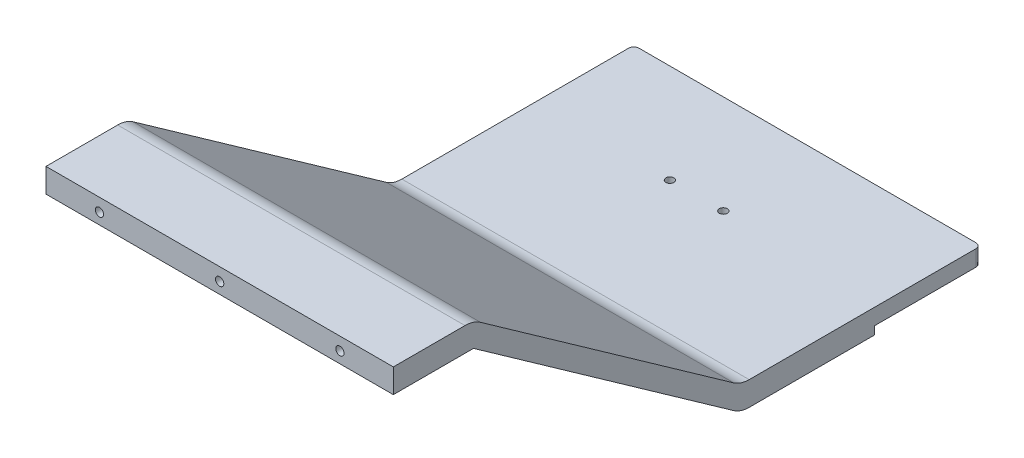
ISO-10303-21;
HEADER;
FILE_DESCRIPTION(('STEP AP214'),'2;1');
FILE_NAME('part.step','',(''),(''),'','','');
FILE_SCHEMA(('AUTOMOTIVE_DESIGN { 1 0 10303 214 1 1 1 1 }'));
ENDSEC;
DATA;
#1=APPLICATION_CONTEXT('core data for automotive mechanical design processes');
#2=APPLICATION_PROTOCOL_DEFINITION('international standard','automotive_design',2000,#1);
#3=PRODUCT_CONTEXT('',#1,'mechanical');
#4=PRODUCT('Part','Part','',(#3));
#5=PRODUCT_RELATED_PRODUCT_CATEGORY('part','',(#4));
#6=PRODUCT_DEFINITION_FORMATION('','',#4);
#7=PRODUCT_DEFINITION_CONTEXT('part definition',#1,'design');
#8=PRODUCT_DEFINITION('design','',#6,#7);
#9=PRODUCT_DEFINITION_SHAPE('','',#8);
#10=(LENGTH_UNIT() NAMED_UNIT(*) SI_UNIT(.MILLI.,.METRE.));
#11=(NAMED_UNIT(*) PLANE_ANGLE_UNIT() SI_UNIT($,.RADIAN.));
#12=(NAMED_UNIT(*) SI_UNIT($,.STERADIAN.) SOLID_ANGLE_UNIT());
#13=UNCERTAINTY_MEASURE_WITH_UNIT(LENGTH_MEASURE(1.E-05),#10,'distance_accuracy_value','');
#14=(GEOMETRIC_REPRESENTATION_CONTEXT(3) GLOBAL_UNCERTAINTY_ASSIGNED_CONTEXT((#13)) GLOBAL_UNIT_ASSIGNED_CONTEXT((#10,
#11,#12)) REPRESENTATION_CONTEXT('',''));
#15=CARTESIAN_POINT('',(0.,0.,0.));
#16=DIRECTION('',(0.,0.,1.));
#17=DIRECTION('',(1.,0.,0.));
#18=AXIS2_PLACEMENT_3D('',#15,#16,#17);
#19=CARTESIAN_POINT('',(209.,70.,-50.));
#20=DIRECTION('',(0.,0.,1.));
#21=DIRECTION('',(1.,0.,0.));
#22=AXIS2_PLACEMENT_3D('',#19,#20,#21);
#23=PLANE('',#22);
#24=DIRECTION('',(0.,1.,0.));
#25=VECTOR('',#24,1.);
#26=CARTESIAN_POINT('',(79.,70.,-50.));
#27=LINE('',#26,#25);
#28=CARTESIAN_POINT('',(79.,70.,-50.));
#29=VERTEX_POINT('',#28);
#30=CARTESIAN_POINT('',(79.,73.,-50.));
#31=VERTEX_POINT('',#30);
#32=EDGE_CURVE('E190',#29,#31,#27,.T.);
#33=ORIENTED_EDGE('',*,*,#32,.T.);
#34=DIRECTION('',(-1.,0.,0.));
#35=VECTOR('',#34,1.);
#36=CARTESIAN_POINT('',(209.,73.,-50.));
#37=LINE('',#36,#35);
#38=CARTESIAN_POINT('',(209.,73.,-50.));
#39=VERTEX_POINT('',#38);
#40=EDGE_CURVE('E252',#39,#31,#37,.T.);
#41=ORIENTED_EDGE('',*,*,#40,.F.);
#42=DIRECTION('',(0.,1.,0.));
#43=VECTOR('',#42,1.);
#44=CARTESIAN_POINT('',(209.,70.,-50.));
#45=LINE('',#44,#43);
#46=CARTESIAN_POINT('',(209.,70.,-50.));
#47=VERTEX_POINT('',#46);
#48=EDGE_CURVE('E196',#47,#39,#45,.T.);
#49=ORIENTED_EDGE('',*,*,#48,.F.);
#50=DIRECTION('',(-1.,0.,0.));
#51=VECTOR('',#50,1.);
#52=CARTESIAN_POINT('',(209.,70.,-50.));
#53=LINE('',#52,#51);
#54=EDGE_CURVE('E212',#47,#29,#53,.T.);
#55=ORIENTED_EDGE('',*,*,#54,.T.);
#56=EDGE_LOOP('',(#33,#41,#49,#55));
#57=FACE_BOUND('',#56,.T.);
#58=ADVANCED_FACE('F57',(#57),#23,.F.);
#59=CARTESIAN_POINT('',(209.,73.,-50.));
#60=DIRECTION('',(0.,1.,0.));
#61=DIRECTION('',(0.,0.,1.));
#62=AXIS2_PLACEMENT_3D('',#59,#60,#61);
#63=PLANE('',#62);
#64=CARTESIAN_POINT('',(129.5,73.,-53.));
#65=DIRECTION('',(0.,-1.,0.));
#66=DIRECTION('',(0.,0.,-1.));
#67=AXIS2_PLACEMENT_3D('',#64,#65,#66);
#68=CIRCLE('',#67,1.5);
#69=CARTESIAN_POINT('',(129.5,73.,-54.5));
#70=VERTEX_POINT('',#69);
#71=EDGE_CURVE('E278',#70,#70,#68,.T.);
#72=ORIENTED_EDGE('',*,*,#71,.F.);
#73=EDGE_LOOP('',(#72));
#74=FACE_BOUND('',#73,.T.);
#75=CARTESIAN_POINT('',(149.5,73.,-53.));
#76=DIRECTION('',(0.,-1.,0.));
#77=DIRECTION('',(0.,0.,-1.));
#78=AXIS2_PLACEMENT_3D('',#75,#76,#77);
#79=CIRCLE('',#78,1.5);
#80=CARTESIAN_POINT('',(149.5,73.,-54.5));
#81=VERTEX_POINT('',#80);
#82=EDGE_CURVE('E557',#81,#81,#79,.T.);
#83=ORIENTED_EDGE('',*,*,#82,.F.);
#84=EDGE_LOOP('',(#83));
#85=FACE_BOUND('',#84,.T.);
#86=DIRECTION('',(-1.,0.,0.));
#87=VECTOR('',#86,1.);
#88=CARTESIAN_POINT('',(209.,73.,-90.));
#89=LINE('',#88,#87);
#90=CARTESIAN_POINT('',(207.,73.,-90.));
#91=VERTEX_POINT('',#90);
#92=CARTESIAN_POINT('',(81.,73.,-90.));
#93=VERTEX_POINT('',#92);
#94=EDGE_CURVE('E247',#91,#93,#89,.T.);
#95=ORIENTED_EDGE('',*,*,#94,.F.);
#96=CARTESIAN_POINT('',(207.,73.,-88.));
#97=DIRECTION('',(0.,1.,0.));
#98=DIRECTION('',(0.,0.,1.));
#99=AXIS2_PLACEMENT_3D('',#96,#97,#98);
#100=CIRCLE('',#99,2.);
#101=CARTESIAN_POINT('',(209.,73.,-88.));
#102=VERTEX_POINT('',#101);
#103=EDGE_CURVE('E270',#91,#102,#100,.F.);
#104=ORIENTED_EDGE('',*,*,#103,.T.);
#105=DIRECTION('',(0.,0.,-1.));
#106=VECTOR('',#105,1.);
#107=CARTESIAN_POINT('',(209.,73.,-50.));
#108=LINE('',#107,#106);
#109=EDGE_CURVE('E198',#39,#102,#108,.T.);
#110=ORIENTED_EDGE('',*,*,#109,.F.);
#111=ORIENTED_EDGE('',*,*,#40,.T.);
#112=DIRECTION('',(0.,0.,-1.));
#113=VECTOR('',#112,1.);
#114=CARTESIAN_POINT('',(79.,73.,-50.));
#115=LINE('',#114,#113);
#116=CARTESIAN_POINT('',(79.,73.,-88.));
#117=VERTEX_POINT('',#116);
#118=EDGE_CURVE('E188',#31,#117,#115,.T.);
#119=ORIENTED_EDGE('',*,*,#118,.T.);
#120=CARTESIAN_POINT('',(81.,73.,-88.));
#121=DIRECTION('',(0.,1.,0.));
#122=DIRECTION('',(0.,0.,1.));
#123=AXIS2_PLACEMENT_3D('',#120,#121,#122);
#124=CIRCLE('',#123,2.);
#125=EDGE_CURVE('E267',#117,#93,#124,.F.);
#126=ORIENTED_EDGE('',*,*,#125,.T.);
#127=EDGE_LOOP('',(#95,#104,#110,#111,#119,#126));
#128=FACE_BOUND('',#127,.T.);
#129=ADVANCED_FACE('F321',(#74,#85,#128),#63,.F.);
#130=CARTESIAN_POINT('',(209.,73.,-90.));
#131=DIRECTION('',(0.,0.,1.));
#132=DIRECTION('',(1.,0.,0.));
#133=AXIS2_PLACEMENT_3D('',#130,#131,#132);
#134=PLANE('',#133);
#135=DIRECTION('',(-1.,0.,0.));
#136=VECTOR('',#135,1.);
#137=CARTESIAN_POINT('',(209.,79.,-90.));
#138=LINE('',#137,#136);
#139=CARTESIAN_POINT('',(207.,79.,-90.));
#140=VERTEX_POINT('',#139);
#141=CARTESIAN_POINT('',(81.,79.,-90.));
#142=VERTEX_POINT('',#141);
#143=EDGE_CURVE('E244',#140,#142,#138,.T.);
#144=ORIENTED_EDGE('',*,*,#143,.F.);
#145=DIRECTION('',(0.,1.,0.));
#146=VECTOR('',#145,1.);
#147=CARTESIAN_POINT('',(207.,73.,-90.));
#148=LINE('',#147,#146);
#149=EDGE_CURVE('E263',#140,#91,#148,.F.);
#150=ORIENTED_EDGE('',*,*,#149,.T.);
#151=ORIENTED_EDGE('',*,*,#94,.T.);
#152=DIRECTION('',(0.,1.,0.));
#153=VECTOR('',#152,1.);
#154=CARTESIAN_POINT('',(81.,73.,-90.));
#155=LINE('',#154,#153);
#156=EDGE_CURVE('E261',#93,#142,#155,.T.);
#157=ORIENTED_EDGE('',*,*,#156,.T.);
#158=EDGE_LOOP('',(#144,#150,#151,#157));
#159=FACE_BOUND('',#158,.T.);
#160=ADVANCED_FACE('F357',(#159),#134,.F.);
#161=CARTESIAN_POINT('',(209.,79.,-90.));
#162=DIRECTION('',(0.,-1.,0.));
#163=DIRECTION('',(0.,0.,-1.));
#164=AXIS2_PLACEMENT_3D('',#161,#162,#163);
#165=PLANE('',#164);
#166=CARTESIAN_POINT('',(129.5,79.,-53.));
#167=DIRECTION('',(0.,-1.,0.));
#168=DIRECTION('',(0.,0.,-1.));
#169=AXIS2_PLACEMENT_3D('',#166,#167,#168);
#170=CIRCLE('',#169,1.5);
#171=CARTESIAN_POINT('',(129.5,79.,-54.5));
#172=VERTEX_POINT('',#171);
#173=EDGE_CURVE('E273',#172,#172,#170,.T.);
#174=ORIENTED_EDGE('',*,*,#173,.T.);
#175=EDGE_LOOP('',(#174));
#176=FACE_BOUND('',#175,.T.);
#177=CARTESIAN_POINT('',(149.5,79.,-53.));
#178=DIRECTION('',(0.,-1.,0.));
#179=DIRECTION('',(0.,0.,-1.));
#180=AXIS2_PLACEMENT_3D('',#177,#178,#179);
#181=CIRCLE('',#180,1.5);
#182=CARTESIAN_POINT('',(149.5,79.,-54.5));
#183=VERTEX_POINT('',#182);
#184=EDGE_CURVE('E275',#183,#183,#181,.T.);
#185=ORIENTED_EDGE('',*,*,#184,.T.);
#186=EDGE_LOOP('',(#185));
#187=FACE_BOUND('',#186,.T.);
#188=DIRECTION('',(0.,0.,1.));
#189=VECTOR('',#188,1.);
#190=CARTESIAN_POINT('',(209.,79.,-90.));
#191=LINE('',#190,#189);
#192=CARTESIAN_POINT('',(209.,79.,-88.));
#193=VERTEX_POINT('',#192);
#194=CARTESIAN_POINT('',(209.,79.,-3.17837245195783));
#195=VERTEX_POINT('',#194);
#196=EDGE_CURVE('E205',#193,#195,#191,.T.);
#197=ORIENTED_EDGE('',*,*,#196,.F.);
#198=CARTESIAN_POINT('',(207.,79.,-88.));
#199=DIRECTION('',(0.,-1.,0.));
#200=DIRECTION('',(0.,0.,-1.));
#201=AXIS2_PLACEMENT_3D('',#198,#199,#200);
#202=CIRCLE('',#201,2.);
#203=EDGE_CURVE('E257',#193,#140,#202,.F.);
#204=ORIENTED_EDGE('',*,*,#203,.T.);
#205=ORIENTED_EDGE('',*,*,#143,.T.);
#206=CARTESIAN_POINT('',(81.,79.,-88.));
#207=DIRECTION('',(0.,-1.,0.));
#208=DIRECTION('',(0.,0.,-1.));
#209=AXIS2_PLACEMENT_3D('',#206,#207,#208);
#210=CIRCLE('',#209,2.);
#211=CARTESIAN_POINT('',(79.,79.,-88.));
#212=VERTEX_POINT('',#211);
#213=EDGE_CURVE('E260',#142,#212,#210,.F.);
#214=ORIENTED_EDGE('',*,*,#213,.T.);
#215=DIRECTION('',(0.,0.,1.));
#216=VECTOR('',#215,1.);
#217=CARTESIAN_POINT('',(79.,79.,-90.));
#218=LINE('',#217,#216);
#219=CARTESIAN_POINT('',(79.,79.,-3.17837245195783));
#220=VERTEX_POINT('',#219);
#221=EDGE_CURVE('E219',#212,#220,#218,.T.);
#222=ORIENTED_EDGE('',*,*,#221,.T.);
#223=DIRECTION('',(-1.,0.,0.));
#224=VECTOR('',#223,1.);
#225=CARTESIAN_POINT('',(209.,79.,-3.17837245195783));
#226=LINE('',#225,#224);
#227=EDGE_CURVE('E245',#195,#220,#226,.T.);
#228=ORIENTED_EDGE('',*,*,#227,.F.);
#229=EDGE_LOOP('',(#197,#204,#205,#214,#222,#228));
#230=FACE_BOUND('',#229,.T.);
#231=ADVANCED_FACE('F334',(#176,#187,#230),#165,.F.);
#232=CARTESIAN_POINT('',(209.,89.,-3.17837245195783));
#233=DIRECTION('',(-1.,0.,0.));
#234=DIRECTION('',(0.,0.,1.));
#235=AXIS2_PLACEMENT_3D('',#232,#233,#234);
#236=CYLINDRICAL_SURFACE('',#235,10.);
#237=CARTESIAN_POINT('',(79.,89.,-3.17837245195783));
#238=DIRECTION('',(-1.,0.,0.));
#239=DIRECTION('',(0.,0.,-1.));
#240=AXIS2_PLACEMENT_3D('',#237,#238,#239);
#241=CIRCLE('',#240,10.);
#242=CARTESIAN_POINT('',(79.,80.8350341907227,2.59513023993843));
#243=VERTEX_POINT('',#242);
#244=EDGE_CURVE('E220',#220,#243,#241,.T.);
#245=ORIENTED_EDGE('',*,*,#244,.T.);
#246=DIRECTION('',(-1.,0.,0.));
#247=VECTOR('',#246,1.);
#248=CARTESIAN_POINT('',(209.,80.8350341907227,2.59513023993843));
#249=LINE('',#248,#247);
#250=CARTESIAN_POINT('',(209.,80.8350341907227,2.59513023993843));
#251=VERTEX_POINT('',#250);
#252=EDGE_CURVE('E237',#251,#243,#249,.T.);
#253=ORIENTED_EDGE('',*,*,#252,.F.);
#254=CARTESIAN_POINT('',(209.,89.,-3.17837245195783));
#255=DIRECTION('',(-1.,0.,0.));
#256=DIRECTION('',(0.,0.,-1.));
#257=AXIS2_PLACEMENT_3D('',#254,#255,#256);
#258=CIRCLE('',#257,10.);
#259=EDGE_CURVE('E203',#195,#251,#258,.T.);
#260=ORIENTED_EDGE('',*,*,#259,.F.);
#261=ORIENTED_EDGE('',*,*,#227,.T.);
#262=EDGE_LOOP('',(#245,#253,#260,#261));
#263=FACE_BOUND('',#262,.T.);
#264=ADVANCED_FACE('F339',(#263),#236,.F.);
#265=CARTESIAN_POINT('',(209.,80.8350341907227,2.59513023993843));
#266=DIRECTION('',(0.,-0.816496580927726,0.577350269189625));
#267=DIRECTION('',(0.,-0.577350269189625,-0.816496580927726));
#268=AXIS2_PLACEMENT_3D('',#265,#266,#267);
#269=PLANE('',#268);
#270=DIRECTION('',(0.,0.577350269189625,0.816496580927726));
#271=VECTOR('',#270,1.);
#272=CARTESIAN_POINT('',(79.,80.8350341907227,2.59513023993843));
#273=LINE('',#272,#271);
#274=CARTESIAN_POINT('',(79.,147.875643927932,97.4048697600616));
#275=VERTEX_POINT('',#274);
#276=EDGE_CURVE('E224',#243,#275,#273,.T.);
#277=ORIENTED_EDGE('',*,*,#276,.T.);
#278=DIRECTION('',(-1.,0.,0.));
#279=VECTOR('',#278,1.);
#280=CARTESIAN_POINT('',(209.,147.875643927932,97.4048697600616));
#281=LINE('',#280,#279);
#282=CARTESIAN_POINT('',(209.,147.875643927932,97.4048697600616));
#283=VERTEX_POINT('',#282);
#284=EDGE_CURVE('E62',#275,#283,#281,.F.);
#285=ORIENTED_EDGE('',*,*,#284,.T.);
#286=DIRECTION('',(0.,0.577350269189625,0.816496580927726));
#287=VECTOR('',#286,1.);
#288=CARTESIAN_POINT('',(209.,80.8350341907227,2.59513023993843));
#289=LINE('',#288,#287);
#290=EDGE_CURVE('E210',#251,#283,#289,.T.);
#291=ORIENTED_EDGE('',*,*,#290,.F.);
#292=ORIENTED_EDGE('',*,*,#252,.T.);
#293=EDGE_LOOP('',(#277,#285,#291,#292));
#294=FACE_BOUND('',#293,.T.);
#295=ADVANCED_FACE('F374',(#294),#269,.F.);
#296=CARTESIAN_POINT('',(209.,140.710678118655,100.));
#297=DIRECTION('',(0.,0.816496580927727,-0.577350269189625));
#298=DIRECTION('',(0.,0.577350269189625,0.816496580927727));
#299=AXIS2_PLACEMENT_3D('',#296,#297,#298);
#300=PLANE('',#299);
#301=DIRECTION('',(0.,-0.577350269189625,-0.816496580927727));
#302=VECTOR('',#301,1.);
#303=CARTESIAN_POINT('',(79.,140.710678118655,100.));
#304=LINE('',#303,#302);
#305=CARTESIAN_POINT('',(79.,140.710678118655,100.));
#306=VERTEX_POINT('',#305);
#307=CARTESIAN_POINT('',(79.,71.8350341907228,2.59513023993842));
#308=VERTEX_POINT('',#307);
#309=EDGE_CURVE('E221',#306,#308,#304,.T.);
#310=ORIENTED_EDGE('',*,*,#309,.T.);
#311=DIRECTION('',(-1.,0.,0.));
#312=VECTOR('',#311,1.);
#313=CARTESIAN_POINT('',(209.,71.8350341907228,2.59513023993842));
#314=LINE('',#313,#312);
#315=CARTESIAN_POINT('',(209.,71.8350341907228,2.59513023993842));
#316=VERTEX_POINT('',#315);
#317=EDGE_CURVE('E234',#316,#308,#314,.T.);
#318=ORIENTED_EDGE('',*,*,#317,.F.);
#319=DIRECTION('',(0.,-0.577350269189625,-0.816496580927727));
#320=VECTOR('',#319,1.);
#321=CARTESIAN_POINT('',(209.,140.710678118655,100.));
#322=LINE('',#321,#320);
#323=CARTESIAN_POINT('',(209.,140.710678118655,100.));
#324=VERTEX_POINT('',#323);
#325=EDGE_CURVE('E209',#324,#316,#322,.T.);
#326=ORIENTED_EDGE('',*,*,#325,.F.);
#327=DIRECTION('',(-1.,0.,0.));
#328=VECTOR('',#327,1.);
#329=CARTESIAN_POINT('',(209.,140.710678118655,100.));
#330=LINE('',#329,#328);
#331=EDGE_CURVE('E240',#324,#306,#330,.T.);
#332=ORIENTED_EDGE('',*,*,#331,.T.);
#333=EDGE_LOOP('',(#310,#318,#326,#332));
#334=FACE_BOUND('',#333,.T.);
#335=ADVANCED_FACE('F304',(#334),#300,.F.);
#336=CARTESIAN_POINT('',(209.,80.,-3.17837245195782));
#337=DIRECTION('',(-1.,0.,0.));
#338=DIRECTION('',(0.,0.,1.));
#339=AXIS2_PLACEMENT_3D('',#336,#337,#338);
#340=CYLINDRICAL_SURFACE('',#339,9.99999999999999);
#341=CARTESIAN_POINT('',(79.,80.,-3.17837245195782));
#342=DIRECTION('',(1.,0.,0.));
#343=DIRECTION('',(0.,0.,-1.));
#344=AXIS2_PLACEMENT_3D('',#341,#342,#343);
#345=CIRCLE('',#344,9.99999999999999);
#346=CARTESIAN_POINT('',(79.,70.,-3.17837245195782));
#347=VERTEX_POINT('',#346);
#348=EDGE_CURVE('E228',#308,#347,#345,.T.);
#349=ORIENTED_EDGE('',*,*,#348,.T.);
#350=DIRECTION('',(-1.,0.,0.));
#351=VECTOR('',#350,1.);
#352=CARTESIAN_POINT('',(209.,70.,-3.17837245195782));
#353=LINE('',#352,#351);
#354=CARTESIAN_POINT('',(209.,70.,-3.17837245195782));
#355=VERTEX_POINT('',#354);
#356=EDGE_CURVE('E233',#355,#347,#353,.T.);
#357=ORIENTED_EDGE('',*,*,#356,.F.);
#358=CARTESIAN_POINT('',(209.,80.,-3.17837245195782));
#359=DIRECTION('',(1.,0.,0.));
#360=DIRECTION('',(0.,0.,-1.));
#361=AXIS2_PLACEMENT_3D('',#358,#359,#360);
#362=CIRCLE('',#361,9.99999999999999);
#363=EDGE_CURVE('E213',#316,#355,#362,.T.);
#364=ORIENTED_EDGE('',*,*,#363,.F.);
#365=ORIENTED_EDGE('',*,*,#317,.T.);
#366=EDGE_LOOP('',(#349,#357,#364,#365));
#367=FACE_BOUND('',#366,.T.);
#368=ADVANCED_FACE('F311',(#367),#340,.T.);
#369=CARTESIAN_POINT('',(209.,70.,-3.17837245195782));
#370=DIRECTION('',(0.,1.,0.));
#371=DIRECTION('',(0.,0.,1.));
#372=AXIS2_PLACEMENT_3D('',#369,#370,#371);
#373=PLANE('',#372);
#374=DIRECTION('',(0.,0.,-1.));
#375=VECTOR('',#374,1.);
#376=CARTESIAN_POINT('',(79.,70.,-3.17837245195782));
#377=LINE('',#376,#375);
#378=EDGE_CURVE('E200',#347,#29,#377,.T.);
#379=ORIENTED_EDGE('',*,*,#378,.T.);
#380=ORIENTED_EDGE('',*,*,#54,.F.);
#381=DIRECTION('',(0.,0.,-1.));
#382=VECTOR('',#381,1.);
#383=CARTESIAN_POINT('',(209.,70.,-3.17837245195782));
#384=LINE('',#383,#382);
#385=EDGE_CURVE('E211',#355,#47,#384,.T.);
#386=ORIENTED_EDGE('',*,*,#385,.F.);
#387=ORIENTED_EDGE('',*,*,#356,.T.);
#388=EDGE_LOOP('',(#379,#380,#386,#387));
#389=FACE_BOUND('',#388,.T.);
#390=ADVANCED_FACE('F314',(#389),#373,.F.);
#391=CARTESIAN_POINT('',(209.,89.,-3.17837245195783));
#392=DIRECTION('',(1.,0.,0.));
#393=DIRECTION('',(0.,0.,-1.));
#394=AXIS2_PLACEMENT_3D('',#391,#392,#393);
#395=PLANE('',#394);
#396=ORIENTED_EDGE('',*,*,#290,.T.);
#397=CARTESIAN_POINT('',(209.,139.710678118655,103.178372451958));
#398=DIRECTION('',(1.,0.,0.));
#399=DIRECTION('',(0.,0.,-1.));
#400=AXIS2_PLACEMENT_3D('',#397,#398,#399);
#401=CIRCLE('',#400,10.);
#402=CARTESIAN_POINT('',(209.,149.710678118655,103.178372451958));
#403=VERTEX_POINT('',#402);
#404=EDGE_CURVE('E12',#283,#403,#401,.T.);
#405=ORIENTED_EDGE('',*,*,#404,.T.);
#406=DIRECTION('',(0.,0.,-1.));
#407=VECTOR('',#406,1.);
#408=CARTESIAN_POINT('',(209.,149.710678118655,130.));
#409=LINE('',#408,#407);
#410=CARTESIAN_POINT('',(209.,149.710678118655,130.));
#411=VERTEX_POINT('',#410);
#412=EDGE_CURVE('E294',#411,#403,#409,.T.);
#413=ORIENTED_EDGE('',*,*,#412,.F.);
#414=DIRECTION('',(0.,1.,0.));
#415=VECTOR('',#414,1.);
#416=CARTESIAN_POINT('',(209.,140.710678118655,130.));
#417=LINE('',#416,#415);
#418=CARTESIAN_POINT('',(209.,140.710678118655,130.));
#419=VERTEX_POINT('',#418);
#420=EDGE_CURVE('E180',#419,#411,#417,.T.);
#421=ORIENTED_EDGE('',*,*,#420,.F.);
#422=DIRECTION('',(0.,0.,-1.));
#423=VECTOR('',#422,1.);
#424=CARTESIAN_POINT('',(209.,140.710678118655,130.));
#425=LINE('',#424,#423);
#426=EDGE_CURVE('E195',#419,#324,#425,.T.);
#427=ORIENTED_EDGE('',*,*,#426,.T.);
#428=ORIENTED_EDGE('',*,*,#325,.T.);
#429=ORIENTED_EDGE('',*,*,#363,.T.);
#430=ORIENTED_EDGE('',*,*,#385,.T.);
#431=ORIENTED_EDGE('',*,*,#48,.T.);
#432=ORIENTED_EDGE('',*,*,#109,.T.);
#433=DIRECTION('',(0.,1.,0.));
#434=VECTOR('',#433,1.);
#435=CARTESIAN_POINT('',(209.,79.,-88.));
#436=LINE('',#435,#434);
#437=EDGE_CURVE('E251',#102,#193,#436,.T.);
#438=ORIENTED_EDGE('',*,*,#437,.T.);
#439=ORIENTED_EDGE('',*,*,#196,.T.);
#440=ORIENTED_EDGE('',*,*,#259,.T.);
#441=EDGE_LOOP('',(#396,#405,#413,#421,#427,#428,#429,#430,#431,#432,#438,#439,#440));
#442=FACE_BOUND('',#441,.T.);
#443=ADVANCED_FACE('F299',(#442),#395,.T.);
#444=CARTESIAN_POINT('',(79.,89.,-3.17837245195783));
#445=DIRECTION('',(1.,0.,0.));
#446=DIRECTION('',(0.,0.,-1.));
#447=AXIS2_PLACEMENT_3D('',#444,#445,#446);
#448=PLANE('',#447);
#449=DIRECTION('',(0.,0.,-1.));
#450=VECTOR('',#449,1.);
#451=CARTESIAN_POINT('',(79.,149.710678118655,130.));
#452=LINE('',#451,#450);
#453=CARTESIAN_POINT('',(79.,149.710678118655,130.));
#454=VERTEX_POINT('',#453);
#455=CARTESIAN_POINT('',(79.,149.710678118655,103.178372451958));
#456=VERTEX_POINT('',#455);
#457=EDGE_CURVE('E164',#454,#456,#452,.T.);
#458=ORIENTED_EDGE('',*,*,#457,.T.);
#459=CARTESIAN_POINT('',(79.,139.710678118655,103.178372451958));
#460=DIRECTION('',(1.,0.,0.));
#461=DIRECTION('',(0.,0.,-1.));
#462=AXIS2_PLACEMENT_3D('',#459,#460,#461);
#463=CIRCLE('',#462,10.);
#464=EDGE_CURVE('E76',#456,#275,#463,.F.);
#465=ORIENTED_EDGE('',*,*,#464,.T.);
#466=ORIENTED_EDGE('',*,*,#276,.F.);
#467=ORIENTED_EDGE('',*,*,#244,.F.);
#468=ORIENTED_EDGE('',*,*,#221,.F.);
#469=DIRECTION('',(0.,1.,0.));
#470=VECTOR('',#469,1.);
#471=CARTESIAN_POINT('',(79.,89.,-88.));
#472=LINE('',#471,#470);
#473=EDGE_CURVE('E268',#212,#117,#472,.F.);
#474=ORIENTED_EDGE('',*,*,#473,.T.);
#475=ORIENTED_EDGE('',*,*,#118,.F.);
#476=ORIENTED_EDGE('',*,*,#32,.F.);
#477=ORIENTED_EDGE('',*,*,#378,.F.);
#478=ORIENTED_EDGE('',*,*,#348,.F.);
#479=ORIENTED_EDGE('',*,*,#309,.F.);
#480=DIRECTION('',(0.,0.,-1.));
#481=VECTOR('',#480,1.);
#482=CARTESIAN_POINT('',(79.,140.710678118655,130.));
#483=LINE('',#482,#481);
#484=CARTESIAN_POINT('',(79.,140.710678118655,130.));
#485=VERTEX_POINT('',#484);
#486=EDGE_CURVE('E166',#485,#306,#483,.T.);
#487=ORIENTED_EDGE('',*,*,#486,.F.);
#488=DIRECTION('',(0.,-1.,0.));
#489=VECTOR('',#488,1.);
#490=CARTESIAN_POINT('',(79.,149.710678118655,130.));
#491=LINE('',#490,#489);
#492=EDGE_CURVE('E163',#454,#485,#491,.T.);
#493=ORIENTED_EDGE('',*,*,#492,.F.);
#494=EDGE_LOOP('',(#458,#465,#466,#467,#468,#474,#475,#476,#477,#478,#479,#487,#493));
#495=FACE_BOUND('',#494,.T.);
#496=ADVANCED_FACE('F161',(#495),#448,.F.);
#497=CARTESIAN_POINT('',(209.,149.710678118655,130.));
#498=DIRECTION('',(0.,-1.,0.));
#499=DIRECTION('',(0.,0.,-1.));
#500=AXIS2_PLACEMENT_3D('',#497,#498,#499);
#501=PLANE('',#500);
#502=ORIENTED_EDGE('',*,*,#412,.T.);
#503=DIRECTION('',(-1.,0.,0.));
#504=VECTOR('',#503,1.);
#505=CARTESIAN_POINT('',(209.,149.710678118655,103.178372451958));
#506=LINE('',#505,#504);
#507=EDGE_CURVE('E187',#403,#456,#506,.T.);
#508=ORIENTED_EDGE('',*,*,#507,.T.);
#509=ORIENTED_EDGE('',*,*,#457,.F.);
#510=DIRECTION('',(-1.,0.,0.));
#511=VECTOR('',#510,1.);
#512=CARTESIAN_POINT('',(209.,149.710678118655,130.));
#513=LINE('',#512,#511);
#514=EDGE_CURVE('E175',#411,#454,#513,.T.);
#515=ORIENTED_EDGE('',*,*,#514,.F.);
#516=EDGE_LOOP('',(#502,#508,#509,#515));
#517=FACE_BOUND('',#516,.T.);
#518=ADVANCED_FACE('F183',(#517),#501,.F.);
#519=CARTESIAN_POINT('',(79.,140.710678118655,130.));
#520=DIRECTION('',(0.,1.,0.));
#521=DIRECTION('',(0.,0.,1.));
#522=AXIS2_PLACEMENT_3D('',#519,#520,#521);
#523=PLANE('',#522);
#524=ORIENTED_EDGE('',*,*,#331,.F.);
#525=ORIENTED_EDGE('',*,*,#426,.F.);
#526=DIRECTION('',(1.,0.,0.));
#527=VECTOR('',#526,1.);
#528=CARTESIAN_POINT('',(79.,140.710678118655,130.));
#529=LINE('',#528,#527);
#530=EDGE_CURVE('E171',#485,#419,#529,.T.);
#531=ORIENTED_EDGE('',*,*,#530,.F.);
#532=ORIENTED_EDGE('',*,*,#486,.T.);
#533=EDGE_LOOP('',(#524,#525,#531,#532));
#534=FACE_BOUND('',#533,.T.);
#535=ADVANCED_FACE('F303',(#534),#523,.F.);
#536=CARTESIAN_POINT('',(0.,0.,130.));
#537=DIRECTION('',(0.,0.,1.));
#538=DIRECTION('',(1.,0.,0.));
#539=AXIS2_PLACEMENT_3D('',#536,#537,#538);
#540=PLANE('',#539);
#541=CARTESIAN_POINT('',(99.,144.890678118655,130.));
#542=DIRECTION('',(0.,0.,1.));
#543=DIRECTION('',(1.,0.,0.));
#544=AXIS2_PLACEMENT_3D('',#541,#542,#543);
#545=CIRCLE('',#544,1.54999999999999);
#546=CARTESIAN_POINT('',(100.55,144.890678118655,130.));
#547=VERTEX_POINT('',#546);
#548=EDGE_CURVE('E555',#547,#547,#545,.T.);
#549=ORIENTED_EDGE('',*,*,#548,.F.);
#550=EDGE_LOOP('',(#549));
#551=FACE_BOUND('',#550,.T.);
#552=CARTESIAN_POINT('',(144.,144.890678118655,130.));
#553=DIRECTION('',(0.,0.,1.));
#554=DIRECTION('',(1.,0.,0.));
#555=AXIS2_PLACEMENT_3D('',#552,#553,#554);
#556=CIRCLE('',#555,1.54999999999999);
#557=CARTESIAN_POINT('',(145.55,144.890678118655,130.));
#558=VERTEX_POINT('',#557);
#559=EDGE_CURVE('E560',#558,#558,#556,.T.);
#560=ORIENTED_EDGE('',*,*,#559,.F.);
#561=EDGE_LOOP('',(#560));
#562=FACE_BOUND('',#561,.T.);
#563=CARTESIAN_POINT('',(189.,144.890678118655,130.));
#564=DIRECTION('',(0.,0.,1.));
#565=DIRECTION('',(1.,0.,0.));
#566=AXIS2_PLACEMENT_3D('',#563,#564,#565);
#567=CIRCLE('',#566,1.54999999999999);
#568=CARTESIAN_POINT('',(190.55,144.890678118655,130.));
#569=VERTEX_POINT('',#568);
#570=EDGE_CURVE('E283',#569,#569,#567,.T.);
#571=ORIENTED_EDGE('',*,*,#570,.F.);
#572=EDGE_LOOP('',(#571));
#573=FACE_BOUND('',#572,.T.);
#574=ORIENTED_EDGE('',*,*,#514,.T.);
#575=ORIENTED_EDGE('',*,*,#492,.T.);
#576=ORIENTED_EDGE('',*,*,#530,.T.);
#577=ORIENTED_EDGE('',*,*,#420,.T.);
#578=EDGE_LOOP('',(#574,#575,#576,#577));
#579=FACE_BOUND('',#578,.T.);
#580=ADVANCED_FACE('F174',(#551,#562,#573,#579),#540,.T.);
#581=CARTESIAN_POINT('',(189.,144.890678118655,125.));
#582=DIRECTION('',(0.,0.,1.));
#583=DIRECTION('',(1.,0.,0.));
#584=AXIS2_PLACEMENT_3D('',#581,#582,#583);
#585=CYLINDRICAL_SURFACE('',#584,1.54999999999999);
#586=CARTESIAN_POINT('',(189.,144.890678118655,125.));
#587=DIRECTION('',(0.,0.,1.));
#588=DIRECTION('',(1.,0.,0.));
#589=AXIS2_PLACEMENT_3D('',#586,#587,#588);
#590=CIRCLE('',#589,1.54999999999999);
#591=CARTESIAN_POINT('',(190.55,144.890678118655,125.));
#592=VERTEX_POINT('',#591);
#593=EDGE_CURVE('E277',#592,#592,#590,.T.);
#594=ORIENTED_EDGE('',*,*,#593,.F.);
#595=EDGE_LOOP('',(#594));
#596=FACE_BOUND('',#595,.T.);
#597=ORIENTED_EDGE('',*,*,#570,.T.);
#598=EDGE_LOOP('',(#597));
#599=FACE_BOUND('',#598,.T.);
#600=ADVANCED_FACE('F502',(#596,#599),#585,.F.);
#601=CARTESIAN_POINT('',(189.,144.890678118655,125.));
#602=DIRECTION('',(0.,0.,1.));
#603=DIRECTION('',(1.,0.,0.));
#604=AXIS2_PLACEMENT_3D('',#601,#602,#603);
#605=PLANE('',#604);
#606=ORIENTED_EDGE('',*,*,#593,.T.);
#607=EDGE_LOOP('',(#606));
#608=FACE_BOUND('',#607,.T.);
#609=ADVANCED_FACE('F514',(#608),#605,.T.);
#610=CARTESIAN_POINT('',(144.,144.890678118655,125.));
#611=DIRECTION('',(0.,0.,1.));
#612=DIRECTION('',(1.,0.,0.));
#613=AXIS2_PLACEMENT_3D('',#610,#611,#612);
#614=CYLINDRICAL_SURFACE('',#613,1.54999999999999);
#615=CARTESIAN_POINT('',(144.,144.890678118655,125.));
#616=DIRECTION('',(0.,0.,1.));
#617=DIRECTION('',(1.,0.,0.));
#618=AXIS2_PLACEMENT_3D('',#615,#616,#617);
#619=CIRCLE('',#618,1.54999999999999);
#620=CARTESIAN_POINT('',(145.55,144.890678118655,125.));
#621=VERTEX_POINT('',#620);
#622=EDGE_CURVE('E286',#621,#621,#619,.T.);
#623=ORIENTED_EDGE('',*,*,#622,.F.);
#624=EDGE_LOOP('',(#623));
#625=FACE_BOUND('',#624,.T.);
#626=ORIENTED_EDGE('',*,*,#559,.T.);
#627=EDGE_LOOP('',(#626));
#628=FACE_BOUND('',#627,.T.);
#629=ADVANCED_FACE('F522',(#625,#628),#614,.F.);
#630=CARTESIAN_POINT('',(144.,144.890678118655,125.));
#631=DIRECTION('',(0.,0.,1.));
#632=DIRECTION('',(1.,0.,0.));
#633=AXIS2_PLACEMENT_3D('',#630,#631,#632);
#634=PLANE('',#633);
#635=ORIENTED_EDGE('',*,*,#622,.T.);
#636=EDGE_LOOP('',(#635));
#637=FACE_BOUND('',#636,.T.);
#638=ADVANCED_FACE('F528',(#637),#634,.T.);
#639=CARTESIAN_POINT('',(99.,144.890678118655,125.));
#640=DIRECTION('',(0.,0.,1.));
#641=DIRECTION('',(1.,0.,0.));
#642=AXIS2_PLACEMENT_3D('',#639,#640,#641);
#643=CYLINDRICAL_SURFACE('',#642,1.54999999999999);
#644=CARTESIAN_POINT('',(99.,144.890678118655,125.));
#645=DIRECTION('',(0.,0.,1.));
#646=DIRECTION('',(1.,0.,0.));
#647=AXIS2_PLACEMENT_3D('',#644,#645,#646);
#648=CIRCLE('',#647,1.54999999999999);
#649=CARTESIAN_POINT('',(100.55,144.890678118655,125.));
#650=VERTEX_POINT('',#649);
#651=EDGE_CURVE('E181',#650,#650,#648,.T.);
#652=ORIENTED_EDGE('',*,*,#651,.F.);
#653=EDGE_LOOP('',(#652));
#654=FACE_BOUND('',#653,.T.);
#655=ORIENTED_EDGE('',*,*,#548,.T.);
#656=EDGE_LOOP('',(#655));
#657=FACE_BOUND('',#656,.T.);
#658=ADVANCED_FACE('F537',(#654,#657),#643,.F.);
#659=CARTESIAN_POINT('',(99.,144.890678118655,125.));
#660=DIRECTION('',(0.,0.,1.));
#661=DIRECTION('',(1.,0.,0.));
#662=AXIS2_PLACEMENT_3D('',#659,#660,#661);
#663=PLANE('',#662);
#664=ORIENTED_EDGE('',*,*,#651,.T.);
#665=EDGE_LOOP('',(#664));
#666=FACE_BOUND('',#665,.T.);
#667=ADVANCED_FACE('F364',(#666),#663,.T.);
#668=CARTESIAN_POINT('',(207.,89.,-88.));
#669=DIRECTION('',(0.,-1.,0.));
#670=DIRECTION('',(0.,0.,-1.));
#671=AXIS2_PLACEMENT_3D('',#668,#669,#670);
#672=CYLINDRICAL_SURFACE('',#671,2.);
#673=ORIENTED_EDGE('',*,*,#103,.F.);
#674=ORIENTED_EDGE('',*,*,#149,.F.);
#675=ORIENTED_EDGE('',*,*,#203,.F.);
#676=ORIENTED_EDGE('',*,*,#437,.F.);
#677=EDGE_LOOP('',(#673,#674,#675,#676));
#678=FACE_BOUND('',#677,.T.);
#679=ADVANCED_FACE('F329',(#678),#672,.T.);
#680=CARTESIAN_POINT('',(81.,73.,-88.));
#681=DIRECTION('',(0.,1.,0.));
#682=DIRECTION('',(0.,0.,1.));
#683=AXIS2_PLACEMENT_3D('',#680,#681,#682);
#684=CYLINDRICAL_SURFACE('',#683,2.);
#685=ORIENTED_EDGE('',*,*,#125,.F.);
#686=ORIENTED_EDGE('',*,*,#473,.F.);
#687=ORIENTED_EDGE('',*,*,#213,.F.);
#688=ORIENTED_EDGE('',*,*,#156,.F.);
#689=EDGE_LOOP('',(#685,#686,#687,#688));
#690=FACE_BOUND('',#689,.T.);
#691=ADVANCED_FACE('F361',(#690),#684,.T.);
#692=CARTESIAN_POINT('',(149.5,149.710678118655,-53.));
#693=DIRECTION('',(0.,-1.,0.));
#694=DIRECTION('',(0.,0.,-1.));
#695=AXIS2_PLACEMENT_3D('',#692,#693,#694);
#696=CYLINDRICAL_SURFACE('',#695,1.5);
#697=CARTESIAN_POINT('',(149.5,73.,-54.5));
#698=CARTESIAN_POINT('',(149.5,73.0625,-54.5));
#699=CARTESIAN_POINT('',(149.5,73.125,-54.5));
#700=CARTESIAN_POINT('',(149.5,73.25,-54.5));
#701=CARTESIAN_POINT('',(149.5,73.3125,-54.5));
#702=CARTESIAN_POINT('',(149.5,73.4375,-54.5));
#703=CARTESIAN_POINT('',(149.5,73.5,-54.5));
#704=CARTESIAN_POINT('',(149.5,73.625,-54.5));
#705=CARTESIAN_POINT('',(149.5,73.6875,-54.5));
#706=CARTESIAN_POINT('',(149.5,73.8125,-54.5));
#707=CARTESIAN_POINT('',(149.5,73.875,-54.5));
#708=CARTESIAN_POINT('',(149.5,74.,-54.5));
#709=CARTESIAN_POINT('',(149.5,74.0625,-54.5));
#710=CARTESIAN_POINT('',(149.5,74.1875,-54.5));
#711=CARTESIAN_POINT('',(149.5,74.25,-54.5));
#712=CARTESIAN_POINT('',(149.5,74.375,-54.5));
#713=CARTESIAN_POINT('',(149.5,74.4375,-54.5));
#714=CARTESIAN_POINT('',(149.5,74.5625,-54.5));
#715=CARTESIAN_POINT('',(149.5,74.625,-54.5));
#716=CARTESIAN_POINT('',(149.5,74.75,-54.5));
#717=CARTESIAN_POINT('',(149.5,74.8125,-54.5));
#718=CARTESIAN_POINT('',(149.5,74.9375,-54.5));
#719=CARTESIAN_POINT('',(149.5,75.,-54.5));
#720=CARTESIAN_POINT('',(149.5,75.125,-54.5));
#721=CARTESIAN_POINT('',(149.5,75.1875,-54.5));
#722=CARTESIAN_POINT('',(149.5,75.3125,-54.5));
#723=CARTESIAN_POINT('',(149.5,75.375,-54.5));
#724=CARTESIAN_POINT('',(149.5,75.5,-54.5));
#725=CARTESIAN_POINT('',(149.5,75.5625,-54.5));
#726=CARTESIAN_POINT('',(149.5,75.6875,-54.5));
#727=CARTESIAN_POINT('',(149.5,75.75,-54.5));
#728=CARTESIAN_POINT('',(149.5,75.875,-54.5));
#729=CARTESIAN_POINT('',(149.5,75.9375,-54.5));
#730=CARTESIAN_POINT('',(149.5,76.0625,-54.5));
#731=CARTESIAN_POINT('',(149.5,76.125,-54.5));
#732=CARTESIAN_POINT('',(149.5,76.25,-54.5));
#733=CARTESIAN_POINT('',(149.5,76.3125,-54.5));
#734=CARTESIAN_POINT('',(149.5,76.4375,-54.5));
#735=CARTESIAN_POINT('',(149.5,76.5,-54.5));
#736=CARTESIAN_POINT('',(149.5,76.625,-54.5));
#737=CARTESIAN_POINT('',(149.5,76.6875,-54.5));
#738=CARTESIAN_POINT('',(149.5,76.8125,-54.5));
#739=CARTESIAN_POINT('',(149.5,76.875,-54.5));
#740=CARTESIAN_POINT('',(149.5,77.,-54.5));
#741=CARTESIAN_POINT('',(149.5,77.0625,-54.5));
#742=CARTESIAN_POINT('',(149.5,77.1875,-54.5));
#743=CARTESIAN_POINT('',(149.5,77.25,-54.5));
#744=CARTESIAN_POINT('',(149.5,77.375,-54.5));
#745=CARTESIAN_POINT('',(149.5,77.4375,-54.5));
#746=CARTESIAN_POINT('',(149.5,77.5625,-54.5));
#747=CARTESIAN_POINT('',(149.5,77.625,-54.5));
#748=CARTESIAN_POINT('',(149.5,77.75,-54.5));
#749=CARTESIAN_POINT('',(149.5,77.8125,-54.5));
#750=CARTESIAN_POINT('',(149.5,77.9375,-54.5));
#751=CARTESIAN_POINT('',(149.5,78.,-54.5));
#752=CARTESIAN_POINT('',(149.5,78.125,-54.5));
#753=CARTESIAN_POINT('',(149.5,78.1875,-54.5));
#754=CARTESIAN_POINT('',(149.5,78.3125,-54.5));
#755=CARTESIAN_POINT('',(149.5,78.375,-54.5));
#756=CARTESIAN_POINT('',(149.5,78.5,-54.5));
#757=CARTESIAN_POINT('',(149.5,78.5625,-54.5));
#758=CARTESIAN_POINT('',(149.5,78.6875,-54.5));
#759=CARTESIAN_POINT('',(149.5,78.75,-54.5));
#760=CARTESIAN_POINT('',(149.5,78.875,-54.5));
#761=CARTESIAN_POINT('',(149.5,78.9375,-54.5));
#762=CARTESIAN_POINT('',(149.5,79.,-54.5));
#763=B_SPLINE_CURVE_WITH_KNOTS('',3,(#697,#698,#699,#700,#701,#702,#703,#704,#705,#706,#707,
#708,#709,#710,#711,#712,#713,#714,#715,#716,#717,#718,#719,#720,#721,#722,#723,#724,#725,#726,
#727,#728,#729,#730,#731,#732,#733,#734,#735,#736,#737,#738,#739,#740,#741,#742,#743,#744,#745,
#746,#747,#748,#749,#750,#751,#752,#753,#754,#755,#756,#757,#758,#759,#760,#761,#762),
.UNSPECIFIED.,.F.,.F.,(4,2,2,2,2,2,2,2,2,2,2,2,2,2,2,2,2,2,2,2,2,2,2,2,2,2,2,2,2,2,2,2,4),(0.,
0.187500000000007,0.375,0.562500000000007,0.750000000000001,0.937500000000008,1.125,
1.31250000000001,1.5,1.68750000000001,1.87500000000002,2.06250000000001,2.25000000000002,
2.43750000000001,2.62500000000002,2.81250000000001,3.00000000000002,3.18750000000002,
3.37500000000002,3.56250000000002,3.75000000000002,3.93750000000002,4.12500000000002,
4.31250000000002,4.50000000000003,4.68750000000002,4.87500000000003,5.06250000000002,
5.25000000000003,5.43750000000003,5.62500000000003,5.81250000000003,6.00000000000003),.UNSPECIFIED.);
#764=EDGE_CURVE('BSEAM349',#81,#183,#763,.T.);
#765=ORIENTED_EDGE('',*,*,#82,.T.);
#766=ORIENTED_EDGE('',*,*,#184,.F.);
#767=ORIENTED_EDGE('',*,*,#764,.T.);
#768=ORIENTED_EDGE('',*,*,#764,.F.);
#769=EDGE_LOOP('',(#765,#767,#766,#768));
#770=FACE_BOUND('',#769,.T.);
#771=ADVANCED_FACE('F349',(#770),#696,.F.);
#772=CARTESIAN_POINT('',(129.5,149.710678118655,-53.));
#773=DIRECTION('',(0.,-1.,0.));
#774=DIRECTION('',(0.,0.,-1.));
#775=AXIS2_PLACEMENT_3D('',#772,#773,#774);
#776=CYLINDRICAL_SURFACE('',#775,1.5);
#777=CARTESIAN_POINT('',(129.5,73.,-54.5));
#778=CARTESIAN_POINT('',(129.5,73.0625,-54.5));
#779=CARTESIAN_POINT('',(129.5,73.125,-54.5));
#780=CARTESIAN_POINT('',(129.5,73.25,-54.5));
#781=CARTESIAN_POINT('',(129.5,73.3125,-54.5));
#782=CARTESIAN_POINT('',(129.5,73.4375,-54.5));
#783=CARTESIAN_POINT('',(129.5,73.5,-54.5));
#784=CARTESIAN_POINT('',(129.5,73.625,-54.5));
#785=CARTESIAN_POINT('',(129.5,73.6875,-54.5));
#786=CARTESIAN_POINT('',(129.5,73.8125,-54.5));
#787=CARTESIAN_POINT('',(129.5,73.875,-54.5));
#788=CARTESIAN_POINT('',(129.5,74.,-54.5));
#789=CARTESIAN_POINT('',(129.5,74.0625,-54.5));
#790=CARTESIAN_POINT('',(129.5,74.1875,-54.5));
#791=CARTESIAN_POINT('',(129.5,74.25,-54.5));
#792=CARTESIAN_POINT('',(129.5,74.375,-54.5));
#793=CARTESIAN_POINT('',(129.5,74.4375,-54.5));
#794=CARTESIAN_POINT('',(129.5,74.5625,-54.5));
#795=CARTESIAN_POINT('',(129.5,74.625,-54.5));
#796=CARTESIAN_POINT('',(129.5,74.75,-54.5));
#797=CARTESIAN_POINT('',(129.5,74.8125,-54.5));
#798=CARTESIAN_POINT('',(129.5,74.9375,-54.5));
#799=CARTESIAN_POINT('',(129.5,75.,-54.5));
#800=CARTESIAN_POINT('',(129.5,75.125,-54.5));
#801=CARTESIAN_POINT('',(129.5,75.1875,-54.5));
#802=CARTESIAN_POINT('',(129.5,75.3125,-54.5));
#803=CARTESIAN_POINT('',(129.5,75.375,-54.5));
#804=CARTESIAN_POINT('',(129.5,75.5,-54.5));
#805=CARTESIAN_POINT('',(129.5,75.5625,-54.5));
#806=CARTESIAN_POINT('',(129.5,75.6875,-54.5));
#807=CARTESIAN_POINT('',(129.5,75.75,-54.5));
#808=CARTESIAN_POINT('',(129.5,75.875,-54.5));
#809=CARTESIAN_POINT('',(129.5,75.9375,-54.5));
#810=CARTESIAN_POINT('',(129.5,76.0625,-54.5));
#811=CARTESIAN_POINT('',(129.5,76.125,-54.5));
#812=CARTESIAN_POINT('',(129.5,76.25,-54.5));
#813=CARTESIAN_POINT('',(129.5,76.3125,-54.5));
#814=CARTESIAN_POINT('',(129.5,76.4375,-54.5));
#815=CARTESIAN_POINT('',(129.5,76.5,-54.5));
#816=CARTESIAN_POINT('',(129.5,76.625,-54.5));
#817=CARTESIAN_POINT('',(129.5,76.6875,-54.5));
#818=CARTESIAN_POINT('',(129.5,76.8125,-54.5));
#819=CARTESIAN_POINT('',(129.5,76.875,-54.5));
#820=CARTESIAN_POINT('',(129.5,77.,-54.5));
#821=CARTESIAN_POINT('',(129.5,77.0625,-54.5));
#822=CARTESIAN_POINT('',(129.5,77.1875,-54.5));
#823=CARTESIAN_POINT('',(129.5,77.25,-54.5));
#824=CARTESIAN_POINT('',(129.5,77.375,-54.5));
#825=CARTESIAN_POINT('',(129.5,77.4375,-54.5));
#826=CARTESIAN_POINT('',(129.5,77.5625,-54.5));
#827=CARTESIAN_POINT('',(129.5,77.625,-54.5));
#828=CARTESIAN_POINT('',(129.5,77.75,-54.5));
#829=CARTESIAN_POINT('',(129.5,77.8125,-54.5));
#830=CARTESIAN_POINT('',(129.5,77.9375,-54.5));
#831=CARTESIAN_POINT('',(129.5,78.,-54.5));
#832=CARTESIAN_POINT('',(129.5,78.125,-54.5));
#833=CARTESIAN_POINT('',(129.5,78.1875,-54.5));
#834=CARTESIAN_POINT('',(129.5,78.3125,-54.5));
#835=CARTESIAN_POINT('',(129.5,78.375,-54.5));
#836=CARTESIAN_POINT('',(129.5,78.5,-54.5));
#837=CARTESIAN_POINT('',(129.5,78.5625,-54.5));
#838=CARTESIAN_POINT('',(129.5,78.6875,-54.5));
#839=CARTESIAN_POINT('',(129.5,78.75,-54.5));
#840=CARTESIAN_POINT('',(129.5,78.875,-54.5));
#841=CARTESIAN_POINT('',(129.5,78.9375,-54.5));
#842=CARTESIAN_POINT('',(129.5,79.,-54.5));
#843=B_SPLINE_CURVE_WITH_KNOTS('',3,(#777,#778,#779,#780,#781,#782,#783,#784,#785,#786,#787,
#788,#789,#790,#791,#792,#793,#794,#795,#796,#797,#798,#799,#800,#801,#802,#803,#804,#805,#806,
#807,#808,#809,#810,#811,#812,#813,#814,#815,#816,#817,#818,#819,#820,#821,#822,#823,#824,#825,
#826,#827,#828,#829,#830,#831,#832,#833,#834,#835,#836,#837,#838,#839,#840,#841,#842),
.UNSPECIFIED.,.F.,.F.,(4,2,2,2,2,2,2,2,2,2,2,2,2,2,2,2,2,2,2,2,2,2,2,2,2,2,2,2,2,2,2,2,4),(0.,
0.187500000000007,0.375,0.562500000000007,0.750000000000001,0.937500000000008,1.125,
1.31250000000001,1.5,1.68750000000001,1.87500000000002,2.06250000000001,2.25000000000002,
2.43750000000001,2.62500000000002,2.81250000000001,3.00000000000002,3.18750000000002,
3.37500000000002,3.56250000000002,3.75000000000002,3.93750000000002,4.12500000000002,
4.31250000000002,4.50000000000003,4.68750000000002,4.87500000000003,5.06250000000002,
5.25000000000003,5.43750000000003,5.62500000000003,5.81250000000003,6.00000000000003),.UNSPECIFIED.);
#844=EDGE_CURVE('BSEAM341',#70,#172,#843,.T.);
#845=ORIENTED_EDGE('',*,*,#71,.T.);
#846=ORIENTED_EDGE('',*,*,#173,.F.);
#847=ORIENTED_EDGE('',*,*,#844,.T.);
#848=ORIENTED_EDGE('',*,*,#844,.F.);
#849=EDGE_LOOP('',(#845,#847,#846,#848));
#850=FACE_BOUND('',#849,.T.);
#851=ADVANCED_FACE('F341',(#850),#776,.F.);
#852=CARTESIAN_POINT('',(209.,139.710678118655,103.178372451958));
#853=DIRECTION('',(-1.,0.,0.));
#854=DIRECTION('',(0.,0.,1.));
#855=AXIS2_PLACEMENT_3D('',#852,#853,#854);
#856=CYLINDRICAL_SURFACE('',#855,10.);
#857=ORIENTED_EDGE('',*,*,#404,.F.);
#858=ORIENTED_EDGE('',*,*,#284,.F.);
#859=ORIENTED_EDGE('',*,*,#464,.F.);
#860=ORIENTED_EDGE('',*,*,#507,.F.);
#861=EDGE_LOOP('',(#857,#858,#859,#860));
#862=FACE_BOUND('',#861,.T.);
#863=ADVANCED_FACE('F59',(#862),#856,.T.);
#864=CLOSED_SHELL('',(#58,#129,#160,#231,#264,#295,#335,#368,#390,#443,#496,#518,#535,#580,#600,
#609,#629,#638,#658,#667,#679,#691,#771,#851,#863));
#865=MANIFOLD_SOLID_BREP('B2',#864);
#866=ADVANCED_BREP_SHAPE_REPRESENTATION('',(#18,#865),#14);
#867=SHAPE_DEFINITION_REPRESENTATION(#9,#866);
ENDSEC;
END-ISO-10303-21;
